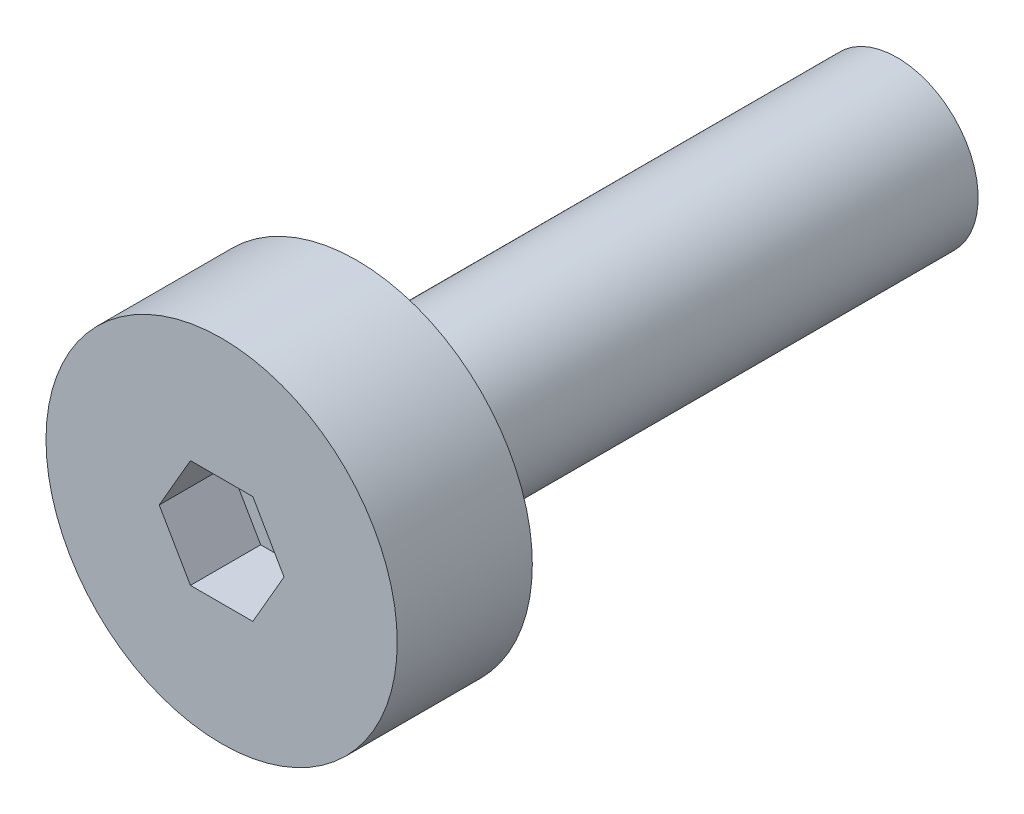
ISO-10303-21;
HEADER;
FILE_DESCRIPTION(('STEP AP214'),'2;1');
FILE_NAME('part.step','',(''),(''),'','','');
FILE_SCHEMA(('AUTOMOTIVE_DESIGN { 1 0 10303 214 1 1 1 1 }'));
ENDSEC;
DATA;
#1=APPLICATION_CONTEXT('core data for automotive mechanical design processes');
#2=APPLICATION_PROTOCOL_DEFINITION('international standard','automotive_design',2000,#1);
#3=PRODUCT_CONTEXT('',#1,'mechanical');
#4=PRODUCT('Part','Part','',(#3));
#5=PRODUCT_RELATED_PRODUCT_CATEGORY('part','',(#4));
#6=PRODUCT_DEFINITION_FORMATION('','',#4);
#7=PRODUCT_DEFINITION_CONTEXT('part definition',#1,'design');
#8=PRODUCT_DEFINITION('design','',#6,#7);
#9=PRODUCT_DEFINITION_SHAPE('','',#8);
#10=(LENGTH_UNIT() NAMED_UNIT(*) SI_UNIT(.MILLI.,.METRE.));
#11=(NAMED_UNIT(*) PLANE_ANGLE_UNIT() SI_UNIT($,.RADIAN.));
#12=(NAMED_UNIT(*) SI_UNIT($,.STERADIAN.) SOLID_ANGLE_UNIT());
#13=UNCERTAINTY_MEASURE_WITH_UNIT(LENGTH_MEASURE(1.E-05),#10,'distance_accuracy_value','');
#14=(GEOMETRIC_REPRESENTATION_CONTEXT(3) GLOBAL_UNCERTAINTY_ASSIGNED_CONTEXT((#13)) GLOBAL_UNIT_ASSIGNED_CONTEXT((#10,
#11,#12)) REPRESENTATION_CONTEXT('',''));
#15=CARTESIAN_POINT('',(0.,0.,0.));
#16=DIRECTION('',(0.,0.,1.));
#17=DIRECTION('',(1.,0.,0.));
#18=AXIS2_PLACEMENT_3D('',#15,#16,#17);
#19=CARTESIAN_POINT('',(0.,0.,1.2));
#20=DIRECTION('',(0.,0.,1.));
#21=DIRECTION('',(1.,0.,0.));
#22=AXIS2_PLACEMENT_3D('',#19,#20,#21);
#23=PLANE('',#22);
#24=DIRECTION('',(-0.50000000000019,0.866025403784329,0.));
#25=VECTOR('',#24,1.);
#26=CARTESIAN_POINT('',(1.154700538379,0.,1.2));
#27=LINE('',#26,#25);
#28=CARTESIAN_POINT('',(1.154700538379,0.,1.2));
#29=VERTEX_POINT('',#28);
#30=CARTESIAN_POINT('',(0.57735026919,1.,1.2));
#31=VERTEX_POINT('',#30);
#32=EDGE_CURVE('E9',#29,#31,#27,.T.);
#33=ORIENTED_EDGE('',*,*,#32,.T.);
#34=DIRECTION('',(-1.,0.,0.));
#35=VECTOR('',#34,1.);
#36=CARTESIAN_POINT('',(0.57735026919,1.,1.2));
#37=LINE('',#36,#35);
#38=CARTESIAN_POINT('',(-0.57735026919,1.,1.2));
#39=VERTEX_POINT('',#38);
#40=EDGE_CURVE('E136',#31,#39,#37,.T.);
#41=ORIENTED_EDGE('',*,*,#40,.T.);
#42=DIRECTION('',(-0.50000000000019,-0.866025403784329,0.));
#43=VECTOR('',#42,1.);
#44=CARTESIAN_POINT('',(-0.57735026919,1.,1.2));
#45=LINE('',#44,#43);
#46=CARTESIAN_POINT('',(-1.154700538379,0.,1.2));
#47=VERTEX_POINT('',#46);
#48=EDGE_CURVE('E18',#39,#47,#45,.T.);
#49=ORIENTED_EDGE('',*,*,#48,.T.);
#50=DIRECTION('',(0.50000000000019,-0.866025403784329,0.));
#51=VECTOR('',#50,1.);
#52=CARTESIAN_POINT('',(-1.154700538379,0.,1.2));
#53=LINE('',#52,#51);
#54=CARTESIAN_POINT('',(-0.57735026919,-1.,1.2));
#55=VERTEX_POINT('',#54);
#56=EDGE_CURVE('E143',#47,#55,#53,.T.);
#57=ORIENTED_EDGE('',*,*,#56,.T.);
#58=DIRECTION('',(1.,0.,0.));
#59=VECTOR('',#58,1.);
#60=CARTESIAN_POINT('',(-0.57735026919,-1.,1.2));
#61=LINE('',#60,#59);
#62=CARTESIAN_POINT('',(0.57735026919,-1.,1.2));
#63=VERTEX_POINT('',#62);
#64=EDGE_CURVE('E127',#55,#63,#61,.T.);
#65=ORIENTED_EDGE('',*,*,#64,.T.);
#66=DIRECTION('',(0.50000000000019,0.866025403784329,0.));
#67=VECTOR('',#66,1.);
#68=CARTESIAN_POINT('',(0.57735026919,-1.,1.2));
#69=LINE('',#68,#67);
#70=EDGE_CURVE('E158',#63,#29,#69,.T.);
#71=ORIENTED_EDGE('',*,*,#70,.T.);
#72=EDGE_LOOP('',(#33,#41,#49,#57,#65,#71));
#73=FACE_BOUND('',#72,.T.);
#74=ADVANCED_FACE('F14',(#73),#23,.T.);
#75=CARTESIAN_POINT('',(0.,0.,-10.));
#76=DIRECTION('',(0.,0.,-1.));
#77=DIRECTION('',(0.,-1.,0.));
#78=AXIS2_PLACEMENT_3D('',#75,#76,#77);
#79=PLANE('',#78);
#80=CARTESIAN_POINT('',(0.,0.,-10.));
#81=DIRECTION('',(0.,0.,-1.));
#82=DIRECTION('',(-1.,0.,0.));
#83=AXIS2_PLACEMENT_3D('',#80,#81,#82);
#84=CIRCLE('',#83,1.5);
#85=CARTESIAN_POINT('',(-1.5,0.,-10.));
#86=VERTEX_POINT('',#85);
#87=EDGE_CURVE('E144',#86,#86,#84,.T.);
#88=ORIENTED_EDGE('',*,*,#87,.T.);
#89=EDGE_LOOP('',(#88));
#90=FACE_BOUND('',#89,.T.);
#91=ADVANCED_FACE('F225',(#90),#79,.T.);
#92=CARTESIAN_POINT('',(1.154700538379,0.,1.2));
#93=DIRECTION('',(-0.866025403784329,-0.50000000000019,0.));
#94=DIRECTION('',(-0.50000000000019,0.866025403784329,0.));
#95=AXIS2_PLACEMENT_3D('',#92,#93,#94);
#96=PLANE('',#95);
#97=ORIENTED_EDGE('',*,*,#32,.F.);
#98=DIRECTION('',(0.,0.,1.));
#99=VECTOR('',#98,1.);
#100=CARTESIAN_POINT('',(1.154700538379,0.,1.2));
#101=LINE('',#100,#99);
#102=CARTESIAN_POINT('',(1.154700538379,0.,2.5));
#103=VERTEX_POINT('',#102);
#104=EDGE_CURVE('E131',#29,#103,#101,.T.);
#105=ORIENTED_EDGE('',*,*,#104,.T.);
#106=DIRECTION('',(-0.50000000000019,0.866025403784329,0.));
#107=VECTOR('',#106,1.);
#108=CARTESIAN_POINT('',(1.010362971082,0.25,2.5));
#109=LINE('',#108,#107);
#110=CARTESIAN_POINT('',(0.57735026919,1.,2.5));
#111=VERTEX_POINT('',#110);
#112=EDGE_CURVE('E135',#103,#111,#109,.T.);
#113=ORIENTED_EDGE('',*,*,#112,.T.);
#114=DIRECTION('',(0.,0.,1.));
#115=VECTOR('',#114,1.);
#116=CARTESIAN_POINT('',(0.57735026919,1.,1.2));
#117=LINE('',#116,#115);
#118=EDGE_CURVE('E25',#31,#111,#117,.T.);
#119=ORIENTED_EDGE('',*,*,#118,.F.);
#120=EDGE_LOOP('',(#97,#105,#113,#119));
#121=FACE_BOUND('',#120,.T.);
#122=ADVANCED_FACE('F206',(#121),#96,.T.);
#123=CARTESIAN_POINT('',(0.57735026919,1.,1.2));
#124=DIRECTION('',(0.,-1.,0.));
#125=DIRECTION('',(-1.,0.,0.));
#126=AXIS2_PLACEMENT_3D('',#123,#124,#125);
#127=PLANE('',#126);
#128=ORIENTED_EDGE('',*,*,#40,.F.);
#129=ORIENTED_EDGE('',*,*,#118,.T.);
#130=DIRECTION('',(-1.,0.,0.));
#131=VECTOR('',#130,1.);
#132=CARTESIAN_POINT('',(0.288675134595,1.,2.5));
#133=LINE('',#132,#131);
#134=CARTESIAN_POINT('',(-0.57735026919,1.,2.5));
#135=VERTEX_POINT('',#134);
#136=EDGE_CURVE('E126',#111,#135,#133,.T.);
#137=ORIENTED_EDGE('',*,*,#136,.T.);
#138=DIRECTION('',(0.,0.,1.));
#139=VECTOR('',#138,1.);
#140=CARTESIAN_POINT('',(-0.57735026919,1.,1.2));
#141=LINE('',#140,#139);
#142=EDGE_CURVE('E139',#39,#135,#141,.T.);
#143=ORIENTED_EDGE('',*,*,#142,.F.);
#144=EDGE_LOOP('',(#128,#129,#137,#143));
#145=FACE_BOUND('',#144,.T.);
#146=ADVANCED_FACE('F210',(#145),#127,.T.);
#147=CARTESIAN_POINT('',(-0.57735026919,1.,1.2));
#148=DIRECTION('',(0.866025403784329,-0.50000000000019,0.));
#149=DIRECTION('',(0.,0.,-1.));
#150=AXIS2_PLACEMENT_3D('',#147,#148,#149);
#151=PLANE('',#150);
#152=ORIENTED_EDGE('',*,*,#48,.F.);
#153=ORIENTED_EDGE('',*,*,#142,.T.);
#154=DIRECTION('',(-0.50000000000019,-0.866025403784329,0.));
#155=VECTOR('',#154,1.);
#156=CARTESIAN_POINT('',(-0.721687836487,0.75,2.5));
#157=LINE('',#156,#155);
#158=CARTESIAN_POINT('',(-1.154700538379,0.,2.5));
#159=VERTEX_POINT('',#158);
#160=EDGE_CURVE('E122',#135,#159,#157,.T.);
#161=ORIENTED_EDGE('',*,*,#160,.T.);
#162=DIRECTION('',(0.,0.,1.));
#163=VECTOR('',#162,1.);
#164=CARTESIAN_POINT('',(-1.154700538379,0.,1.2));
#165=LINE('',#164,#163);
#166=EDGE_CURVE('E140',#47,#159,#165,.T.);
#167=ORIENTED_EDGE('',*,*,#166,.F.);
#168=EDGE_LOOP('',(#152,#153,#161,#167));
#169=FACE_BOUND('',#168,.T.);
#170=ADVANCED_FACE('F213',(#169),#151,.T.);
#171=CARTESIAN_POINT('',(-1.154700538379,0.,1.2));
#172=DIRECTION('',(0.866025403784329,0.50000000000019,0.));
#173=DIRECTION('',(0.,0.,-1.));
#174=AXIS2_PLACEMENT_3D('',#171,#172,#173);
#175=PLANE('',#174);
#176=ORIENTED_EDGE('',*,*,#56,.F.);
#177=ORIENTED_EDGE('',*,*,#166,.T.);
#178=DIRECTION('',(0.50000000000019,-0.866025403784329,0.));
#179=VECTOR('',#178,1.);
#180=CARTESIAN_POINT('',(-1.010362971082,-0.25,2.5));
#181=LINE('',#180,#179);
#182=CARTESIAN_POINT('',(-0.57735026919,-1.,2.5));
#183=VERTEX_POINT('',#182);
#184=EDGE_CURVE('E121',#159,#183,#181,.T.);
#185=ORIENTED_EDGE('',*,*,#184,.T.);
#186=DIRECTION('',(0.,0.,1.));
#187=VECTOR('',#186,1.);
#188=CARTESIAN_POINT('',(-0.57735026919,-1.,1.2));
#189=LINE('',#188,#187);
#190=EDGE_CURVE('E130',#55,#183,#189,.T.);
#191=ORIENTED_EDGE('',*,*,#190,.F.);
#192=EDGE_LOOP('',(#176,#177,#185,#191));
#193=FACE_BOUND('',#192,.T.);
#194=ADVANCED_FACE('F190',(#193),#175,.T.);
#195=CARTESIAN_POINT('',(-0.57735026919,-1.,1.2));
#196=DIRECTION('',(0.,1.,0.));
#197=DIRECTION('',(1.,0.,0.));
#198=AXIS2_PLACEMENT_3D('',#195,#196,#197);
#199=PLANE('',#198);
#200=ORIENTED_EDGE('',*,*,#64,.F.);
#201=ORIENTED_EDGE('',*,*,#190,.T.);
#202=DIRECTION('',(1.,0.,0.));
#203=VECTOR('',#202,1.);
#204=CARTESIAN_POINT('',(-0.288675134595,-1.,2.5));
#205=LINE('',#204,#203);
#206=CARTESIAN_POINT('',(0.57735026919,-1.,2.5));
#207=VERTEX_POINT('',#206);
#208=EDGE_CURVE('E112',#183,#207,#205,.T.);
#209=ORIENTED_EDGE('',*,*,#208,.T.);
#210=DIRECTION('',(0.,0.,1.));
#211=VECTOR('',#210,1.);
#212=CARTESIAN_POINT('',(0.57735026919,-1.,1.2));
#213=LINE('',#212,#211);
#214=EDGE_CURVE('E160',#63,#207,#213,.T.);
#215=ORIENTED_EDGE('',*,*,#214,.F.);
#216=EDGE_LOOP('',(#200,#201,#209,#215));
#217=FACE_BOUND('',#216,.T.);
#218=ADVANCED_FACE('F184',(#217),#199,.T.);
#219=CARTESIAN_POINT('',(0.57735026919,-1.,1.2));
#220=DIRECTION('',(-0.866025403784329,0.50000000000019,0.));
#221=DIRECTION('',(0.,0.,1.));
#222=AXIS2_PLACEMENT_3D('',#219,#220,#221);
#223=PLANE('',#222);
#224=ORIENTED_EDGE('',*,*,#70,.F.);
#225=ORIENTED_EDGE('',*,*,#214,.T.);
#226=DIRECTION('',(0.50000000000019,0.866025403784329,0.));
#227=VECTOR('',#226,1.);
#228=CARTESIAN_POINT('',(0.721687836487,-0.75,2.5));
#229=LINE('',#228,#227);
#230=EDGE_CURVE('E149',#207,#103,#229,.T.);
#231=ORIENTED_EDGE('',*,*,#230,.T.);
#232=ORIENTED_EDGE('',*,*,#104,.F.);
#233=EDGE_LOOP('',(#224,#225,#231,#232));
#234=FACE_BOUND('',#233,.T.);
#235=ADVANCED_FACE('F199',(#234),#223,.T.);
#236=CARTESIAN_POINT('',(0.,0.,0.));
#237=DIRECTION('',(0.,0.,-1.));
#238=DIRECTION('',(-1.,0.,0.));
#239=AXIS2_PLACEMENT_3D('',#236,#237,#238);
#240=CYLINDRICAL_SURFACE('',#239,1.5);
#241=ORIENTED_EDGE('',*,*,#87,.F.);
#242=DIRECTION('',(0.,0.,-1.));
#243=VECTOR('',#242,1.);
#244=CARTESIAN_POINT('',(-1.5,0.,0.));
#245=LINE('',#244,#243);
#246=CARTESIAN_POINT('',(-1.5,0.,0.));
#247=VERTEX_POINT('',#246);
#248=EDGE_CURVE('E148',#247,#86,#245,.T.);
#249=ORIENTED_EDGE('',*,*,#248,.F.);
#250=CARTESIAN_POINT('',(0.,0.,0.));
#251=DIRECTION('',(0.,0.,-1.));
#252=DIRECTION('',(-1.,0.,0.));
#253=AXIS2_PLACEMENT_3D('',#250,#251,#252);
#254=CIRCLE('',#253,1.5);
#255=EDGE_CURVE('E105',#247,#247,#254,.T.);
#256=ORIENTED_EDGE('',*,*,#255,.T.);
#257=ORIENTED_EDGE('',*,*,#248,.T.);
#258=EDGE_LOOP('',(#241,#249,#256,#257));
#259=FACE_BOUND('',#258,.T.);
#260=ADVANCED_FACE('F238',(#259),#240,.T.);
#261=CARTESIAN_POINT('',(0.,0.,2.5));
#262=DIRECTION('',(0.,0.,-1.));
#263=DIRECTION('',(0.,-1.,0.));
#264=AXIS2_PLACEMENT_3D('',#261,#262,#263);
#265=PLANE('',#264);
#266=ORIENTED_EDGE('',*,*,#208,.F.);
#267=ORIENTED_EDGE('',*,*,#184,.F.);
#268=ORIENTED_EDGE('',*,*,#160,.F.);
#269=ORIENTED_EDGE('',*,*,#136,.F.);
#270=ORIENTED_EDGE('',*,*,#112,.F.);
#271=ORIENTED_EDGE('',*,*,#230,.F.);
#272=EDGE_LOOP('',(#266,#267,#268,#269,#270,#271));
#273=FACE_BOUND('',#272,.T.);
#274=CARTESIAN_POINT('',(0.,0.,2.5));
#275=DIRECTION('',(0.,0.,-1.));
#276=DIRECTION('',(-1.,0.,0.));
#277=AXIS2_PLACEMENT_3D('',#274,#275,#276);
#278=CIRCLE('',#277,3.25);
#279=CARTESIAN_POINT('',(-3.25,0.,2.5));
#280=VERTEX_POINT('',#279);
#281=EDGE_CURVE('E101',#280,#280,#278,.T.);
#282=ORIENTED_EDGE('',*,*,#281,.F.);
#283=EDGE_LOOP('',(#282));
#284=FACE_BOUND('',#283,.T.);
#285=ADVANCED_FACE('F16',(#273,#284),#265,.F.);
#286=CARTESIAN_POINT('',(0.,0.,0.));
#287=DIRECTION('',(0.,0.,-1.));
#288=DIRECTION('',(0.,-1.,0.));
#289=AXIS2_PLACEMENT_3D('',#286,#287,#288);
#290=PLANE('',#289);
#291=ORIENTED_EDGE('',*,*,#255,.F.);
#292=EDGE_LOOP('',(#291));
#293=FACE_BOUND('',#292,.T.);
#294=CARTESIAN_POINT('',(0.,0.,0.));
#295=DIRECTION('',(0.,0.,-1.));
#296=DIRECTION('',(-1.,0.,0.));
#297=AXIS2_PLACEMENT_3D('',#294,#295,#296);
#298=CIRCLE('',#297,3.25);
#299=CARTESIAN_POINT('',(-3.25,0.,0.));
#300=VERTEX_POINT('',#299);
#301=EDGE_CURVE('E115',#300,#300,#298,.T.);
#302=ORIENTED_EDGE('',*,*,#301,.T.);
#303=EDGE_LOOP('',(#302));
#304=FACE_BOUND('',#303,.T.);
#305=ADVANCED_FACE('F236',(#293,#304),#290,.T.);
#306=CARTESIAN_POINT('',(0.,0.,2.5));
#307=DIRECTION('',(0.,0.,-1.));
#308=DIRECTION('',(-1.,0.,0.));
#309=AXIS2_PLACEMENT_3D('',#306,#307,#308);
#310=CYLINDRICAL_SURFACE('',#309,3.25);
#311=ORIENTED_EDGE('',*,*,#301,.F.);
#312=DIRECTION('',(0.,0.,-1.));
#313=VECTOR('',#312,1.);
#314=CARTESIAN_POINT('',(-3.25,0.,2.5));
#315=LINE('',#314,#313);
#316=EDGE_CURVE('E96',#280,#300,#315,.T.);
#317=ORIENTED_EDGE('',*,*,#316,.F.);
#318=ORIENTED_EDGE('',*,*,#281,.T.);
#319=ORIENTED_EDGE('',*,*,#316,.T.);
#320=EDGE_LOOP('',(#311,#317,#318,#319));
#321=FACE_BOUND('',#320,.T.);
#322=ADVANCED_FACE('F102',(#321),#310,.T.);
#323=CLOSED_SHELL('',(#74,#91,#122,#146,#170,#194,#218,#235,#260,#285,#305,#322));
#324=MANIFOLD_SOLID_BREP('B1',#323);
#325=ADVANCED_BREP_SHAPE_REPRESENTATION('',(#18,#324),#14);
#326=SHAPE_DEFINITION_REPRESENTATION(#9,#325);
ENDSEC;
END-ISO-10303-21;
